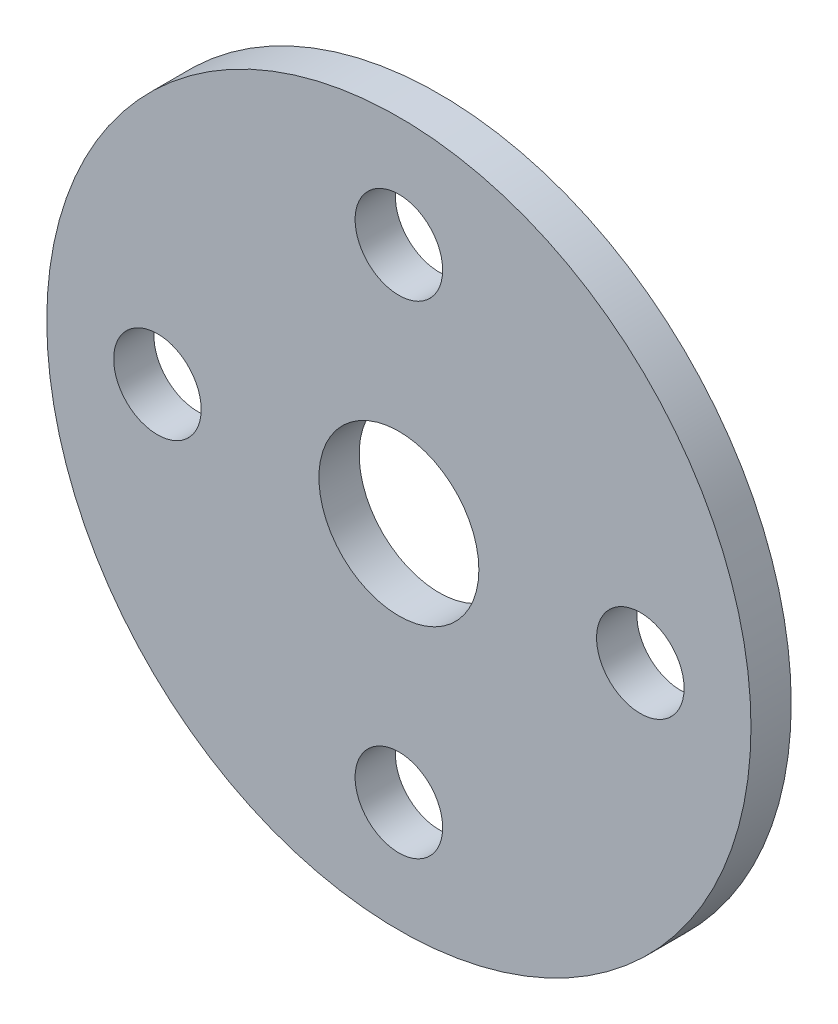
ISO-10303-21;
HEADER;
FILE_DESCRIPTION(('STEP AP214'),'2;1');
FILE_NAME('part.step','',(''),(''),'','','');
FILE_SCHEMA(('AUTOMOTIVE_DESIGN { 1 0 10303 214 1 1 1 1 }'));
ENDSEC;
DATA;
#1=APPLICATION_CONTEXT('core data for automotive mechanical design processes');
#2=APPLICATION_PROTOCOL_DEFINITION('international standard','automotive_design',2000,#1);
#3=PRODUCT_CONTEXT('',#1,'mechanical');
#4=PRODUCT('Part','Part','',(#3));
#5=PRODUCT_RELATED_PRODUCT_CATEGORY('part','',(#4));
#6=PRODUCT_DEFINITION_FORMATION('','',#4);
#7=PRODUCT_DEFINITION_CONTEXT('part definition',#1,'design');
#8=PRODUCT_DEFINITION('design','',#6,#7);
#9=PRODUCT_DEFINITION_SHAPE('','',#8);
#10=(LENGTH_UNIT() NAMED_UNIT(*) SI_UNIT(.MILLI.,.METRE.));
#11=(NAMED_UNIT(*) PLANE_ANGLE_UNIT() SI_UNIT($,.RADIAN.));
#12=(NAMED_UNIT(*) SI_UNIT($,.STERADIAN.) SOLID_ANGLE_UNIT());
#13=UNCERTAINTY_MEASURE_WITH_UNIT(LENGTH_MEASURE(1.E-05),#10,'distance_accuracy_value','');
#14=(GEOMETRIC_REPRESENTATION_CONTEXT(3) GLOBAL_UNCERTAINTY_ASSIGNED_CONTEXT((#13)) GLOBAL_UNIT_ASSIGNED_CONTEXT((#10,
#11,#12)) REPRESENTATION_CONTEXT('',''));
#15=CARTESIAN_POINT('',(0.,0.,0.));
#16=DIRECTION('',(0.,0.,1.));
#17=DIRECTION('',(1.,0.,0.));
#18=AXIS2_PLACEMENT_3D('',#15,#16,#17);
#19=CARTESIAN_POINT('',(0.,0.,2.));
#20=DIRECTION('',(0.,0.,1.));
#21=DIRECTION('',(1.,0.,0.));
#22=AXIS2_PLACEMENT_3D('',#19,#20,#21);
#23=PLANE('',#22);
#24=CARTESIAN_POINT('',(-12.,0.,2.));
#25=DIRECTION('',(0.,0.,1.));
#26=DIRECTION('',(1.,0.,0.));
#27=AXIS2_PLACEMENT_3D('',#24,#25,#26);
#28=CIRCLE('',#27,2.175);
#29=CARTESIAN_POINT('',(-9.825,0.,2.));
#30=VERTEX_POINT('',#29);
#31=EDGE_CURVE('E59',#30,#30,#28,.T.);
#32=ORIENTED_EDGE('',*,*,#31,.F.);
#33=EDGE_LOOP('',(#32));
#34=FACE_BOUND('',#33,.T.);
#35=CARTESIAN_POINT('',(12.,0.,2.));
#36=DIRECTION('',(0.,0.,1.));
#37=DIRECTION('',(1.,0.,0.));
#38=AXIS2_PLACEMENT_3D('',#35,#36,#37);
#39=CIRCLE('',#38,2.175);
#40=CARTESIAN_POINT('',(14.175,0.,2.));
#41=VERTEX_POINT('',#40);
#42=EDGE_CURVE('E47',#41,#41,#39,.T.);
#43=ORIENTED_EDGE('',*,*,#42,.F.);
#44=EDGE_LOOP('',(#43));
#45=FACE_BOUND('',#44,.T.);
#46=CARTESIAN_POINT('',(0.,0.,2.));
#47=DIRECTION('',(0.,0.,1.));
#48=DIRECTION('',(1.,0.,0.));
#49=AXIS2_PLACEMENT_3D('',#46,#47,#48);
#50=CIRCLE('',#49,17.5);
#51=CARTESIAN_POINT('',(17.5,0.,2.));
#52=VERTEX_POINT('',#51);
#53=EDGE_CURVE('E10',#52,#52,#50,.T.);
#54=ORIENTED_EDGE('',*,*,#53,.T.);
#55=EDGE_LOOP('',(#54));
#56=FACE_BOUND('',#55,.T.);
#57=CARTESIAN_POINT('',(0.,0.,2.));
#58=DIRECTION('',(0.,0.,1.));
#59=DIRECTION('',(1.,0.,0.));
#60=AXIS2_PLACEMENT_3D('',#57,#58,#59);
#61=CIRCLE('',#60,3.975);
#62=CARTESIAN_POINT('',(3.975,0.,2.));
#63=VERTEX_POINT('',#62);
#64=EDGE_CURVE('E42',#63,#63,#61,.T.);
#65=ORIENTED_EDGE('',*,*,#64,.F.);
#66=EDGE_LOOP('',(#65));
#67=FACE_BOUND('',#66,.T.);
#68=CARTESIAN_POINT('',(0.,12.,2.));
#69=DIRECTION('',(0.,0.,1.));
#70=DIRECTION('',(1.,0.,0.));
#71=AXIS2_PLACEMENT_3D('',#68,#69,#70);
#72=CIRCLE('',#71,2.175);
#73=CARTESIAN_POINT('',(2.175,12.,2.));
#74=VERTEX_POINT('',#73);
#75=EDGE_CURVE('E53',#74,#74,#72,.T.);
#76=ORIENTED_EDGE('',*,*,#75,.F.);
#77=EDGE_LOOP('',(#76));
#78=FACE_BOUND('',#77,.T.);
#79=CARTESIAN_POINT('',(0.,-12.,2.));
#80=DIRECTION('',(0.,0.,1.));
#81=DIRECTION('',(1.,0.,0.));
#82=AXIS2_PLACEMENT_3D('',#79,#80,#81);
#83=CIRCLE('',#82,2.175);
#84=CARTESIAN_POINT('',(2.175,-12.,2.));
#85=VERTEX_POINT('',#84);
#86=EDGE_CURVE('E65',#85,#85,#83,.T.);
#87=ORIENTED_EDGE('',*,*,#86,.F.);
#88=EDGE_LOOP('',(#87));
#89=FACE_BOUND('',#88,.T.);
#90=ADVANCED_FACE('F31',(#34,#45,#56,#67,#78,#89),#23,.T.);
#91=CARTESIAN_POINT('',(0.,0.,0.));
#92=DIRECTION('',(0.,0.,1.));
#93=DIRECTION('',(1.,0.,0.));
#94=AXIS2_PLACEMENT_3D('',#91,#92,#93);
#95=PLANE('',#94);
#96=CARTESIAN_POINT('',(0.,0.,0.));
#97=DIRECTION('',(0.,0.,1.));
#98=DIRECTION('',(1.,0.,0.));
#99=AXIS2_PLACEMENT_3D('',#96,#97,#98);
#100=CIRCLE('',#99,17.5);
#101=CARTESIAN_POINT('',(17.5,0.,0.));
#102=VERTEX_POINT('',#101);
#103=EDGE_CURVE('E35',#102,#102,#100,.T.);
#104=ORIENTED_EDGE('',*,*,#103,.F.);
#105=EDGE_LOOP('',(#104));
#106=FACE_BOUND('',#105,.T.);
#107=CARTESIAN_POINT('',(0.,0.,0.));
#108=DIRECTION('',(0.,0.,1.));
#109=DIRECTION('',(1.,0.,0.));
#110=AXIS2_PLACEMENT_3D('',#107,#108,#109);
#111=CIRCLE('',#110,3.975);
#112=CARTESIAN_POINT('',(3.975,0.,0.));
#113=VERTEX_POINT('',#112);
#114=EDGE_CURVE('E44',#113,#113,#111,.T.);
#115=ORIENTED_EDGE('',*,*,#114,.T.);
#116=EDGE_LOOP('',(#115));
#117=FACE_BOUND('',#116,.T.);
#118=CARTESIAN_POINT('',(12.,0.,0.));
#119=DIRECTION('',(0.,0.,1.));
#120=DIRECTION('',(1.,0.,0.));
#121=AXIS2_PLACEMENT_3D('',#118,#119,#120);
#122=CIRCLE('',#121,2.175);
#123=CARTESIAN_POINT('',(14.175,0.,0.));
#124=VERTEX_POINT('',#123);
#125=EDGE_CURVE('E50',#124,#124,#122,.T.);
#126=ORIENTED_EDGE('',*,*,#125,.T.);
#127=EDGE_LOOP('',(#126));
#128=FACE_BOUND('',#127,.T.);
#129=CARTESIAN_POINT('',(0.,12.,0.));
#130=DIRECTION('',(0.,0.,1.));
#131=DIRECTION('',(1.,0.,0.));
#132=AXIS2_PLACEMENT_3D('',#129,#130,#131);
#133=CIRCLE('',#132,2.175);
#134=CARTESIAN_POINT('',(2.175,12.,0.));
#135=VERTEX_POINT('',#134);
#136=EDGE_CURVE('E56',#135,#135,#133,.T.);
#137=ORIENTED_EDGE('',*,*,#136,.T.);
#138=EDGE_LOOP('',(#137));
#139=FACE_BOUND('',#138,.T.);
#140=CARTESIAN_POINT('',(-12.,0.,0.));
#141=DIRECTION('',(0.,0.,1.));
#142=DIRECTION('',(1.,0.,0.));
#143=AXIS2_PLACEMENT_3D('',#140,#141,#142);
#144=CIRCLE('',#143,2.175);
#145=CARTESIAN_POINT('',(-9.825,0.,0.));
#146=VERTEX_POINT('',#145);
#147=EDGE_CURVE('E62',#146,#146,#144,.T.);
#148=ORIENTED_EDGE('',*,*,#147,.T.);
#149=EDGE_LOOP('',(#148));
#150=FACE_BOUND('',#149,.T.);
#151=CARTESIAN_POINT('',(0.,-12.,0.));
#152=DIRECTION('',(0.,0.,1.));
#153=DIRECTION('',(1.,0.,0.));
#154=AXIS2_PLACEMENT_3D('',#151,#152,#153);
#155=CIRCLE('',#154,2.175);
#156=CARTESIAN_POINT('',(2.175,-12.,0.));
#157=VERTEX_POINT('',#156);
#158=EDGE_CURVE('E68',#157,#157,#155,.T.);
#159=ORIENTED_EDGE('',*,*,#158,.T.);
#160=EDGE_LOOP('',(#159));
#161=FACE_BOUND('',#160,.T.);
#162=ADVANCED_FACE('F78',(#106,#117,#128,#139,#150,#161),#95,.F.);
#163=CARTESIAN_POINT('',(0.,0.,2.));
#164=DIRECTION('',(0.,0.,-1.));
#165=DIRECTION('',(-1.,0.,0.));
#166=AXIS2_PLACEMENT_3D('',#163,#164,#165);
#167=CYLINDRICAL_SURFACE('',#166,17.5);
#168=ORIENTED_EDGE('',*,*,#53,.F.);
#169=EDGE_LOOP('',(#168));
#170=FACE_BOUND('',#169,.T.);
#171=ORIENTED_EDGE('',*,*,#103,.T.);
#172=EDGE_LOOP('',(#171));
#173=FACE_BOUND('',#172,.T.);
#174=ADVANCED_FACE('F33',(#170,#173),#167,.T.);
#175=CARTESIAN_POINT('',(0.,0.,2.));
#176=DIRECTION('',(0.,0.,-1.));
#177=DIRECTION('',(-1.,0.,0.));
#178=AXIS2_PLACEMENT_3D('',#175,#176,#177);
#179=CYLINDRICAL_SURFACE('',#178,3.975);
#180=ORIENTED_EDGE('',*,*,#64,.T.);
#181=EDGE_LOOP('',(#180));
#182=FACE_BOUND('',#181,.T.);
#183=ORIENTED_EDGE('',*,*,#114,.F.);
#184=EDGE_LOOP('',(#183));
#185=FACE_BOUND('',#184,.T.);
#186=ADVANCED_FACE('F88',(#182,#185),#179,.F.);
#187=CARTESIAN_POINT('',(12.,0.,2.));
#188=DIRECTION('',(0.,0.,-1.));
#189=DIRECTION('',(-1.,0.,0.));
#190=AXIS2_PLACEMENT_3D('',#187,#188,#189);
#191=CYLINDRICAL_SURFACE('',#190,2.175);
#192=ORIENTED_EDGE('',*,*,#42,.T.);
#193=EDGE_LOOP('',(#192));
#194=FACE_BOUND('',#193,.T.);
#195=ORIENTED_EDGE('',*,*,#125,.F.);
#196=EDGE_LOOP('',(#195));
#197=FACE_BOUND('',#196,.T.);
#198=ADVANCED_FACE('F91',(#194,#197),#191,.F.);
#199=CARTESIAN_POINT('',(0.,12.,2.));
#200=DIRECTION('',(0.,0.,-1.));
#201=DIRECTION('',(-1.,0.,0.));
#202=AXIS2_PLACEMENT_3D('',#199,#200,#201);
#203=CYLINDRICAL_SURFACE('',#202,2.175);
#204=ORIENTED_EDGE('',*,*,#75,.T.);
#205=EDGE_LOOP('',(#204));
#206=FACE_BOUND('',#205,.T.);
#207=ORIENTED_EDGE('',*,*,#136,.F.);
#208=EDGE_LOOP('',(#207));
#209=FACE_BOUND('',#208,.T.);
#210=ADVANCED_FACE('F95',(#206,#209),#203,.F.);
#211=CARTESIAN_POINT('',(-12.,0.,2.));
#212=DIRECTION('',(0.,0.,-1.));
#213=DIRECTION('',(-1.,0.,0.));
#214=AXIS2_PLACEMENT_3D('',#211,#212,#213);
#215=CYLINDRICAL_SURFACE('',#214,2.175);
#216=ORIENTED_EDGE('',*,*,#31,.T.);
#217=EDGE_LOOP('',(#216));
#218=FACE_BOUND('',#217,.T.);
#219=ORIENTED_EDGE('',*,*,#147,.F.);
#220=EDGE_LOOP('',(#219));
#221=FACE_BOUND('',#220,.T.);
#222=ADVANCED_FACE('F99',(#218,#221),#215,.F.);
#223=CARTESIAN_POINT('',(0.,-12.,2.));
#224=DIRECTION('',(0.,0.,-1.));
#225=DIRECTION('',(-1.,0.,0.));
#226=AXIS2_PLACEMENT_3D('',#223,#224,#225);
#227=CYLINDRICAL_SURFACE('',#226,2.175);
#228=ORIENTED_EDGE('',*,*,#86,.T.);
#229=EDGE_LOOP('',(#228));
#230=FACE_BOUND('',#229,.T.);
#231=ORIENTED_EDGE('',*,*,#158,.F.);
#232=EDGE_LOOP('',(#231));
#233=FACE_BOUND('',#232,.T.);
#234=ADVANCED_FACE('F74',(#230,#233),#227,.F.);
#235=CLOSED_SHELL('',(#90,#162,#174,#186,#198,#210,#222,#234));
#236=MANIFOLD_SOLID_BREP('B2',#235);
#237=ADVANCED_BREP_SHAPE_REPRESENTATION('',(#18,#236),#14);
#238=SHAPE_DEFINITION_REPRESENTATION(#9,#237);
ENDSEC;
END-ISO-10303-21;
